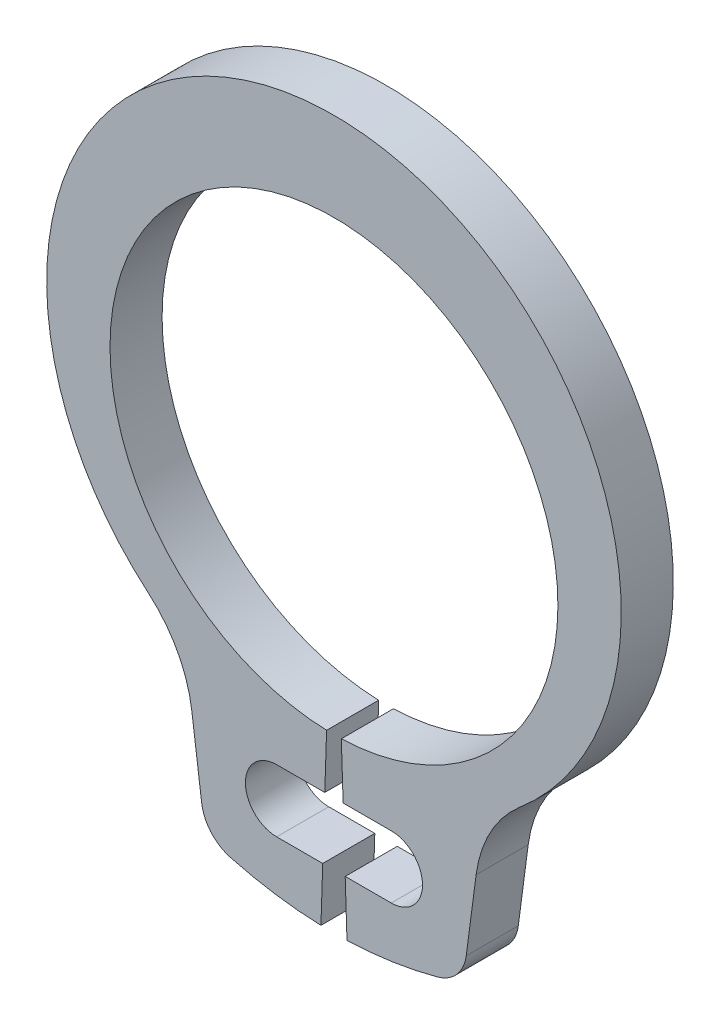
ISO-10303-21;
HEADER;
FILE_DESCRIPTION(('STEP AP214'),'2;1');
FILE_NAME('part.step','',(''),(''),'','','');
FILE_SCHEMA(('AUTOMOTIVE_DESIGN { 1 0 10303 214 1 1 1 1 }'));
ENDSEC;
DATA;
#1=APPLICATION_CONTEXT('core data for automotive mechanical design processes');
#2=APPLICATION_PROTOCOL_DEFINITION('international standard','automotive_design',2000,#1);
#3=PRODUCT_CONTEXT('',#1,'mechanical');
#4=PRODUCT('Part','Part','',(#3));
#5=PRODUCT_RELATED_PRODUCT_CATEGORY('part','',(#4));
#6=PRODUCT_DEFINITION_FORMATION('','',#4);
#7=PRODUCT_DEFINITION_CONTEXT('part definition',#1,'design');
#8=PRODUCT_DEFINITION('design','',#6,#7);
#9=PRODUCT_DEFINITION_SHAPE('','',#8);
#10=(LENGTH_UNIT() NAMED_UNIT(*) SI_UNIT(.MILLI.,.METRE.));
#11=(NAMED_UNIT(*) PLANE_ANGLE_UNIT() SI_UNIT($,.RADIAN.));
#12=(NAMED_UNIT(*) SI_UNIT($,.STERADIAN.) SOLID_ANGLE_UNIT());
#13=UNCERTAINTY_MEASURE_WITH_UNIT(LENGTH_MEASURE(1.E-05),#10,'distance_accuracy_value','');
#14=(GEOMETRIC_REPRESENTATION_CONTEXT(3) GLOBAL_UNCERTAINTY_ASSIGNED_CONTEXT((#13)) GLOBAL_UNIT_ASSIGNED_CONTEXT((#10,
#11,#12)) REPRESENTATION_CONTEXT('',''));
#15=CARTESIAN_POINT('',(0.,0.,0.));
#16=DIRECTION('',(0.,0.,1.));
#17=DIRECTION('',(1.,0.,0.));
#18=AXIS2_PLACEMENT_3D('',#15,#16,#17);
#19=CARTESIAN_POINT('',(-0.141447368421053,-4.29767293334041,-1.));
#20=DIRECTION('',(0.999458821707072,-0.0328947368421052,0.));
#21=DIRECTION('',(0.0328947368421053,0.999458821707072,0.));
#22=AXIS2_PLACEMENT_3D('',#19,#20,#21);
#23=PLANE('',#22);
#24=DIRECTION('',(0.,0.,1.));
#25=VECTOR('',#24,1.);
#26=CARTESIAN_POINT('',(-0.176054474376866,-5.34915960451558,-1.));
#27=LINE('',#26,#25);
#28=CARTESIAN_POINT('',(-0.176054474376866,-5.34915960451558,-1.));
#29=VERTEX_POINT('',#28);
#30=CARTESIAN_POINT('',(-0.176054474376866,-5.34915960451558,0.));
#31=VERTEX_POINT('',#30);
#32=EDGE_CURVE('E217',#29,#31,#27,.T.);
#33=ORIENTED_EDGE('',*,*,#32,.F.);
#34=DIRECTION('',(0.0328947368421053,0.999458821707072,0.));
#35=VECTOR('',#34,1.);
#36=CARTESIAN_POINT('',(-0.141447368421053,-4.29767293334041,-1.));
#37=LINE('',#36,#35);
#38=CARTESIAN_POINT('',(-0.141447368421053,-4.29767293334041,-1.));
#39=VERTEX_POINT('',#38);
#40=EDGE_CURVE('E200',#29,#39,#37,.T.);
#41=ORIENTED_EDGE('',*,*,#40,.T.);
#42=DIRECTION('',(0.,0.,1.));
#43=VECTOR('',#42,1.);
#44=CARTESIAN_POINT('',(-0.141447368421053,-4.29767293334041,-1.));
#45=LINE('',#44,#43);
#46=CARTESIAN_POINT('',(-0.141447368421053,-4.29767293334041,0.));
#47=VERTEX_POINT('',#46);
#48=EDGE_CURVE('E11',#39,#47,#45,.T.);
#49=ORIENTED_EDGE('',*,*,#48,.T.);
#50=DIRECTION('',(0.0328947368421053,0.999458821707072,0.));
#51=VECTOR('',#50,1.);
#52=CARTESIAN_POINT('',(-0.141447368421053,-4.29767293334041,0.));
#53=LINE('',#52,#51);
#54=EDGE_CURVE('E318',#31,#47,#53,.T.);
#55=ORIENTED_EDGE('',*,*,#54,.F.);
#56=EDGE_LOOP('',(#33,#41,#49,#55));
#57=FACE_BOUND('',#56,.T.);
#58=ADVANCED_FACE('F38',(#57),#23,.T.);
#59=CARTESIAN_POINT('',(0.141447368421053,-4.29767293334041,-1.));
#60=DIRECTION('',(-0.999458821707072,-0.0328947368421052,0.));
#61=DIRECTION('',(0.0328947368421053,-0.999458821707072,0.));
#62=AXIS2_PLACEMENT_3D('',#59,#60,#61);
#63=PLANE('',#62);
#64=DIRECTION('',(0.,0.,-1.));
#65=VECTOR('',#64,1.);
#66=CARTESIAN_POINT('',(0.176054474376866,-5.34915960451558,-1.));
#67=LINE('',#66,#65);
#68=CARTESIAN_POINT('',(0.176054474376866,-5.34915960451558,0.));
#69=VERTEX_POINT('',#68);
#70=CARTESIAN_POINT('',(0.176054474376866,-5.34915960451558,-1.));
#71=VERTEX_POINT('',#70);
#72=EDGE_CURVE('E365',#69,#71,#67,.T.);
#73=ORIENTED_EDGE('',*,*,#72,.F.);
#74=DIRECTION('',(0.0328947368421053,-0.999458821707072,0.));
#75=VECTOR('',#74,1.);
#76=CARTESIAN_POINT('',(0.141447368421053,-4.29767293334041,0.));
#77=LINE('',#76,#75);
#78=CARTESIAN_POINT('',(0.141447368421053,-4.29767293334041,0.));
#79=VERTEX_POINT('',#78);
#80=EDGE_CURVE('E278',#79,#69,#77,.T.);
#81=ORIENTED_EDGE('',*,*,#80,.F.);
#82=DIRECTION('',(0.,0.,1.));
#83=VECTOR('',#82,1.);
#84=CARTESIAN_POINT('',(0.141447368421053,-4.29767293334041,-1.));
#85=LINE('',#84,#83);
#86=CARTESIAN_POINT('',(0.141447368421053,-4.29767293334041,-1.));
#87=VERTEX_POINT('',#86);
#88=EDGE_CURVE('E42',#87,#79,#85,.T.);
#89=ORIENTED_EDGE('',*,*,#88,.F.);
#90=DIRECTION('',(0.0328947368421053,-0.999458821707072,0.));
#91=VECTOR('',#90,1.);
#92=CARTESIAN_POINT('',(0.141447368421053,-4.29767293334041,-1.));
#93=LINE('',#92,#91);
#94=EDGE_CURVE('E231',#87,#71,#93,.T.);
#95=ORIENTED_EDGE('',*,*,#94,.T.);
#96=EDGE_LOOP('',(#73,#81,#89,#95));
#97=FACE_BOUND('',#96,.T.);
#98=ADVANCED_FACE('F364',(#97),#63,.T.);
#99=CARTESIAN_POINT('',(0.,0.,-1.));
#100=DIRECTION('',(0.,0.,1.));
#101=DIRECTION('',(1.,0.,0.));
#102=AXIS2_PLACEMENT_3D('',#99,#100,#101);
#103=CYLINDRICAL_SURFACE('',#102,4.3);
#104=CARTESIAN_POINT('',(0.,0.,0.));
#105=DIRECTION('',(0.,0.,-1.));
#106=DIRECTION('',(1.,0.,0.));
#107=AXIS2_PLACEMENT_3D('',#104,#105,#106);
#108=CIRCLE('',#107,4.3);
#109=EDGE_CURVE('E223',#47,#79,#108,.T.);
#110=ORIENTED_EDGE('',*,*,#109,.F.);
#111=ORIENTED_EDGE('',*,*,#48,.F.);
#112=CARTESIAN_POINT('',(0.,0.,-1.));
#113=DIRECTION('',(0.,0.,-1.));
#114=DIRECTION('',(1.,0.,0.));
#115=AXIS2_PLACEMENT_3D('',#112,#113,#114);
#116=CIRCLE('',#115,4.3);
#117=EDGE_CURVE('E225',#39,#87,#116,.T.);
#118=ORIENTED_EDGE('',*,*,#117,.T.);
#119=ORIENTED_EDGE('',*,*,#88,.T.);
#120=EDGE_LOOP('',(#110,#111,#118,#119));
#121=FACE_BOUND('',#120,.T.);
#122=ADVANCED_FACE('F40',(#121),#103,.F.);
#123=DIRECTION('',(0.,0.,-1.));
#124=VECTOR('',#123,1.);
#125=CARTESIAN_POINT('',(-0.215549532455502,-6.54915960451558,-1.));
#126=LINE('',#125,#124);
#127=CARTESIAN_POINT('',(-0.215549532455502,-6.54915960451558,0.));
#128=VERTEX_POINT('',#127);
#129=CARTESIAN_POINT('',(-0.215549532455502,-6.54915960451558,-1.));
#130=VERTEX_POINT('',#129);
#131=EDGE_CURVE('E398',#128,#130,#126,.T.);
#132=ORIENTED_EDGE('',*,*,#131,.F.);
#133=CARTESIAN_POINT('',(-0.25,-7.59588704497375,0.));
#134=VERTEX_POINT('',#133);
#135=EDGE_CURVE('E230',#134,#128,#53,.T.);
#136=ORIENTED_EDGE('',*,*,#135,.F.);
#137=DIRECTION('',(0.,0.,1.));
#138=VECTOR('',#137,1.);
#139=CARTESIAN_POINT('',(-0.25,-7.59588704497375,-1.));
#140=LINE('',#139,#138);
#141=CARTESIAN_POINT('',(-0.25,-7.59588704497375,-1.));
#142=VERTEX_POINT('',#141);
#143=EDGE_CURVE('E48',#142,#134,#140,.T.);
#144=ORIENTED_EDGE('',*,*,#143,.F.);
#145=EDGE_CURVE('E270',#142,#130,#37,.T.);
#146=ORIENTED_EDGE('',*,*,#145,.T.);
#147=EDGE_LOOP('',(#132,#136,#144,#146));
#148=FACE_BOUND('',#147,.T.);
#149=ADVANCED_FACE('F467',(#148),#23,.T.);
#150=CARTESIAN_POINT('',(0.,0.,-1.));
#151=DIRECTION('',(0.,0.,1.));
#152=DIRECTION('',(1.,0.,0.));
#153=AXIS2_PLACEMENT_3D('',#150,#151,#152);
#154=CYLINDRICAL_SURFACE('',#153,7.6);
#155=CARTESIAN_POINT('',(0.,0.,0.));
#156=DIRECTION('',(0.,0.,1.));
#157=DIRECTION('',(1.,0.,0.));
#158=AXIS2_PLACEMENT_3D('',#155,#156,#157);
#159=CIRCLE('',#158,7.6);
#160=CARTESIAN_POINT('',(-1.99252293458548,-7.33415655376614,0.));
#161=VERTEX_POINT('',#160);
#162=EDGE_CURVE('E314',#161,#134,#159,.T.);
#163=ORIENTED_EDGE('',*,*,#162,.F.);
#164=DIRECTION('',(0.,0.,1.));
#165=VECTOR('',#164,1.);
#166=CARTESIAN_POINT('',(-1.99252293458548,-7.33415655376614,-1.));
#167=LINE('',#166,#165);
#168=CARTESIAN_POINT('',(-1.99252293458548,-7.33415655376614,-1.));
#169=VERTEX_POINT('',#168);
#170=EDGE_CURVE('E324',#169,#161,#167,.T.);
#171=ORIENTED_EDGE('',*,*,#170,.F.);
#172=CARTESIAN_POINT('',(0.,0.,-1.));
#173=DIRECTION('',(0.,0.,1.));
#174=DIRECTION('',(1.,0.,0.));
#175=AXIS2_PLACEMENT_3D('',#172,#173,#174);
#176=CIRCLE('',#175,7.6);
#177=EDGE_CURVE('E266',#169,#142,#176,.T.);
#178=ORIENTED_EDGE('',*,*,#177,.T.);
#179=ORIENTED_EDGE('',*,*,#143,.T.);
#180=EDGE_LOOP('',(#163,#171,#178,#179));
#181=FACE_BOUND('',#180,.T.);
#182=ADVANCED_FACE('F472',(#181),#154,.T.);
#183=CARTESIAN_POINT('',(-1.79589238183033,-6.61039110438133,-1.));
#184=DIRECTION('',(0.,0.,1.));
#185=DIRECTION('',(1.,0.,0.));
#186=AXIS2_PLACEMENT_3D('',#183,#184,#185);
#187=CYLINDRICAL_SURFACE('',#186,0.749999999999999);
#188=CARTESIAN_POINT('',(-1.79589238183033,-6.61039110438133,0.));
#189=DIRECTION('',(0.,0.,1.));
#190=DIRECTION('',(1.,0.,0.));
#191=AXIS2_PLACEMENT_3D('',#188,#189,#190);
#192=CIRCLE('',#191,0.749999999999999);
#193=CARTESIAN_POINT('',(-2.53947602786069,-6.70828574854637,0.));
#194=VERTEX_POINT('',#193);
#195=EDGE_CURVE('E310',#194,#161,#192,.T.);
#196=ORIENTED_EDGE('',*,*,#195,.F.);
#197=DIRECTION('',(0.,0.,1.));
#198=VECTOR('',#197,1.);
#199=CARTESIAN_POINT('',(-2.53947602786069,-6.70828574854637,-1.));
#200=LINE('',#199,#198);
#201=CARTESIAN_POINT('',(-2.53947602786069,-6.70828574854637,-1.));
#202=VERTEX_POINT('',#201);
#203=EDGE_CURVE('E327',#202,#194,#200,.T.);
#204=ORIENTED_EDGE('',*,*,#203,.F.);
#205=CARTESIAN_POINT('',(-1.79589238183033,-6.61039110438133,-1.));
#206=DIRECTION('',(0.,0.,1.));
#207=DIRECTION('',(1.,0.,0.));
#208=AXIS2_PLACEMENT_3D('',#205,#206,#207);
#209=CIRCLE('',#208,0.749999999999999);
#210=EDGE_CURVE('E262',#202,#169,#209,.T.);
#211=ORIENTED_EDGE('',*,*,#210,.T.);
#212=ORIENTED_EDGE('',*,*,#170,.T.);
#213=EDGE_LOOP('',(#196,#204,#211,#212));
#214=FACE_BOUND('',#213,.T.);
#215=ADVANCED_FACE('F460',(#214),#187,.T.);
#216=CARTESIAN_POINT('',(-2.72955632905345,-5.2644825190134,-1.));
#217=DIRECTION('',(-0.99144486137381,-0.130526192220052,0.));
#218=DIRECTION('',(0.130526192220052,-0.99144486137381,0.));
#219=AXIS2_PLACEMENT_3D('',#216,#217,#218);
#220=PLANE('',#219);
#221=DIRECTION('',(0.130526192220052,-0.99144486137381,0.));
#222=VECTOR('',#221,1.);
#223=CARTESIAN_POINT('',(-2.72955632905345,-5.2644825190134,0.));
#224=LINE('',#223,#222);
#225=CARTESIAN_POINT('',(-2.72955632905345,-5.2644825190134,0.));
#226=VERTEX_POINT('',#225);
#227=EDGE_CURVE('E306',#226,#194,#224,.T.);
#228=ORIENTED_EDGE('',*,*,#227,.F.);
#229=DIRECTION('',(0.,0.,1.));
#230=VECTOR('',#229,1.);
#231=CARTESIAN_POINT('',(-2.72955632905345,-5.2644825190134,-1.));
#232=LINE('',#231,#230);
#233=CARTESIAN_POINT('',(-2.72955632905345,-5.2644825190134,-1.));
#234=VERTEX_POINT('',#233);
#235=EDGE_CURVE('E330',#234,#226,#232,.T.);
#236=ORIENTED_EDGE('',*,*,#235,.F.);
#237=DIRECTION('',(0.130526192220052,-0.99144486137381,0.));
#238=VECTOR('',#237,1.);
#239=CARTESIAN_POINT('',(-2.72955632905345,-5.2644825190134,-1.));
#240=LINE('',#239,#238);
#241=EDGE_CURVE('E258',#234,#202,#240,.T.);
#242=ORIENTED_EDGE('',*,*,#241,.T.);
#243=ORIENTED_EDGE('',*,*,#203,.T.);
#244=EDGE_LOOP('',(#228,#236,#242,#243));
#245=FACE_BOUND('',#244,.T.);
#246=ADVANCED_FACE('F456',(#245),#220,.T.);
#247=CARTESIAN_POINT('',(-5.15560880600109,-5.58387838688165,-1.));
#248=DIRECTION('',(0.,0.,1.));
#249=DIRECTION('',(1.,0.,0.));
#250=AXIS2_PLACEMENT_3D('',#247,#248,#249);
#251=CYLINDRICAL_SURFACE('',#250,2.4469867881366);
#252=CARTESIAN_POINT('',(-5.15560880600109,-5.58387838688165,0.));
#253=DIRECTION('',(0.,0.,-1.));
#254=DIRECTION('',(1.,0.,0.));
#255=AXIS2_PLACEMENT_3D('',#252,#253,#254);
#256=CIRCLE('',#255,2.4469867881366);
#257=CARTESIAN_POINT('',(-3.57124666917764,-3.71906178444716,0.));
#258=VERTEX_POINT('',#257);
#259=EDGE_CURVE('E302',#258,#226,#256,.T.);
#260=ORIENTED_EDGE('',*,*,#259,.F.);
#261=DIRECTION('',(0.,0.,1.));
#262=VECTOR('',#261,1.);
#263=CARTESIAN_POINT('',(-3.57124666917764,-3.71906178444716,-1.));
#264=LINE('',#263,#262);
#265=CARTESIAN_POINT('',(-3.57124666917764,-3.71906178444716,-1.));
#266=VERTEX_POINT('',#265);
#267=EDGE_CURVE('E333',#266,#258,#264,.T.);
#268=ORIENTED_EDGE('',*,*,#267,.F.);
#269=CARTESIAN_POINT('',(-5.15560880600109,-5.58387838688165,-1.));
#270=DIRECTION('',(0.,0.,-1.));
#271=DIRECTION('',(1.,0.,0.));
#272=AXIS2_PLACEMENT_3D('',#269,#270,#271);
#273=CIRCLE('',#272,2.4469867881366);
#274=EDGE_CURVE('E254',#266,#234,#273,.T.);
#275=ORIENTED_EDGE('',*,*,#274,.T.);
#276=ORIENTED_EDGE('',*,*,#235,.T.);
#277=EDGE_LOOP('',(#260,#268,#275,#276));
#278=FACE_BOUND('',#277,.T.);
#279=ADVANCED_FACE('F452',(#278),#251,.F.);
#280=CARTESIAN_POINT('',(0.,0.484345962612266,-1.));
#281=DIRECTION('',(0.,0.,1.));
#282=DIRECTION('',(1.,0.,0.));
#283=AXIS2_PLACEMENT_3D('',#280,#281,#282);
#284=CYLINDRICAL_SURFACE('',#283,5.51565403738773);
#285=CARTESIAN_POINT('',(0.,0.484345962612266,0.));
#286=DIRECTION('',(0.,0.,1.));
#287=DIRECTION('',(1.,0.,0.));
#288=AXIS2_PLACEMENT_3D('',#285,#286,#287);
#289=CIRCLE('',#288,5.51565403738773);
#290=CARTESIAN_POINT('',(3.57124666917764,-3.71906178444716,0.));
#291=VERTEX_POINT('',#290);
#292=EDGE_CURVE('E298',#291,#258,#289,.T.);
#293=ORIENTED_EDGE('',*,*,#292,.F.);
#294=DIRECTION('',(0.,0.,1.));
#295=VECTOR('',#294,1.);
#296=CARTESIAN_POINT('',(3.57124666917764,-3.71906178444716,-1.));
#297=LINE('',#296,#295);
#298=CARTESIAN_POINT('',(3.57124666917764,-3.71906178444716,-1.));
#299=VERTEX_POINT('',#298);
#300=EDGE_CURVE('E336',#299,#291,#297,.T.);
#301=ORIENTED_EDGE('',*,*,#300,.F.);
#302=CARTESIAN_POINT('',(0.,0.484345962612266,-1.));
#303=DIRECTION('',(0.,0.,1.));
#304=DIRECTION('',(1.,0.,0.));
#305=AXIS2_PLACEMENT_3D('',#302,#303,#304);
#306=CIRCLE('',#305,5.51565403738773);
#307=EDGE_CURVE('E250',#299,#266,#306,.T.);
#308=ORIENTED_EDGE('',*,*,#307,.T.);
#309=ORIENTED_EDGE('',*,*,#267,.T.);
#310=EDGE_LOOP('',(#293,#301,#308,#309));
#311=FACE_BOUND('',#310,.T.);
#312=ADVANCED_FACE('F448',(#311),#284,.T.);
#313=CARTESIAN_POINT('',(5.15560880600109,-5.58387838688165,-1.));
#314=DIRECTION('',(0.,0.,1.));
#315=DIRECTION('',(1.,0.,0.));
#316=AXIS2_PLACEMENT_3D('',#313,#314,#315);
#317=CYLINDRICAL_SURFACE('',#316,2.4469867881366);
#318=CARTESIAN_POINT('',(5.15560880600109,-5.58387838688165,0.));
#319=DIRECTION('',(0.,0.,-1.));
#320=DIRECTION('',(1.,0.,0.));
#321=AXIS2_PLACEMENT_3D('',#318,#319,#320);
#322=CIRCLE('',#321,2.4469867881366);
#323=CARTESIAN_POINT('',(2.72955632905346,-5.2644825190134,0.));
#324=VERTEX_POINT('',#323);
#325=EDGE_CURVE('E294',#324,#291,#322,.T.);
#326=ORIENTED_EDGE('',*,*,#325,.F.);
#327=DIRECTION('',(0.,0.,1.));
#328=VECTOR('',#327,1.);
#329=CARTESIAN_POINT('',(2.72955632905346,-5.2644825190134,-1.));
#330=LINE('',#329,#328);
#331=CARTESIAN_POINT('',(2.72955632905346,-5.2644825190134,-1.));
#332=VERTEX_POINT('',#331);
#333=EDGE_CURVE('E339',#332,#324,#330,.T.);
#334=ORIENTED_EDGE('',*,*,#333,.F.);
#335=CARTESIAN_POINT('',(5.15560880600109,-5.58387838688165,-1.));
#336=DIRECTION('',(0.,0.,-1.));
#337=DIRECTION('',(1.,0.,0.));
#338=AXIS2_PLACEMENT_3D('',#335,#336,#337);
#339=CIRCLE('',#338,2.4469867881366);
#340=EDGE_CURVE('E246',#332,#299,#339,.T.);
#341=ORIENTED_EDGE('',*,*,#340,.T.);
#342=ORIENTED_EDGE('',*,*,#300,.T.);
#343=EDGE_LOOP('',(#326,#334,#341,#342));
#344=FACE_BOUND('',#343,.T.);
#345=ADVANCED_FACE('F444',(#344),#317,.F.);
#346=CARTESIAN_POINT('',(2.72955632905345,-5.2644825190134,-1.));
#347=DIRECTION('',(0.99144486137381,-0.130526192220052,0.));
#348=DIRECTION('',(0.130526192220052,0.99144486137381,0.));
#349=AXIS2_PLACEMENT_3D('',#346,#347,#348);
#350=PLANE('',#349);
#351=DIRECTION('',(0.130526192220052,0.99144486137381,0.));
#352=VECTOR('',#351,1.);
#353=CARTESIAN_POINT('',(2.72955632905345,-5.2644825190134,0.));
#354=LINE('',#353,#352);
#355=CARTESIAN_POINT('',(2.53947602786069,-6.70828574854637,0.));
#356=VERTEX_POINT('',#355);
#357=EDGE_CURVE('E290',#356,#324,#354,.T.);
#358=ORIENTED_EDGE('',*,*,#357,.F.);
#359=DIRECTION('',(0.,0.,1.));
#360=VECTOR('',#359,1.);
#361=CARTESIAN_POINT('',(2.53947602786069,-6.70828574854637,-1.));
#362=LINE('',#361,#360);
#363=CARTESIAN_POINT('',(2.53947602786069,-6.70828574854637,-1.));
#364=VERTEX_POINT('',#363);
#365=EDGE_CURVE('E342',#364,#356,#362,.T.);
#366=ORIENTED_EDGE('',*,*,#365,.F.);
#367=DIRECTION('',(0.130526192220052,0.99144486137381,0.));
#368=VECTOR('',#367,1.);
#369=CARTESIAN_POINT('',(2.72955632905345,-5.2644825190134,-1.));
#370=LINE('',#369,#368);
#371=EDGE_CURVE('E242',#364,#332,#370,.T.);
#372=ORIENTED_EDGE('',*,*,#371,.T.);
#373=ORIENTED_EDGE('',*,*,#333,.T.);
#374=EDGE_LOOP('',(#358,#366,#372,#373));
#375=FACE_BOUND('',#374,.T.);
#376=ADVANCED_FACE('F441',(#375),#350,.T.);
#377=CARTESIAN_POINT('',(1.79589238183033,-6.61039110438133,-1.));
#378=DIRECTION('',(0.,0.,1.));
#379=DIRECTION('',(1.,0.,0.));
#380=AXIS2_PLACEMENT_3D('',#377,#378,#379);
#381=CYLINDRICAL_SURFACE('',#380,0.749999999999999);
#382=CARTESIAN_POINT('',(1.79589238183033,-6.61039110438133,0.));
#383=DIRECTION('',(0.,0.,1.));
#384=DIRECTION('',(-1.,0.,0.));
#385=AXIS2_PLACEMENT_3D('',#382,#383,#384);
#386=CIRCLE('',#385,0.749999999999999);
#387=CARTESIAN_POINT('',(1.99252293458548,-7.33415655376614,0.));
#388=VERTEX_POINT('',#387);
#389=EDGE_CURVE('E286',#388,#356,#386,.T.);
#390=ORIENTED_EDGE('',*,*,#389,.F.);
#391=DIRECTION('',(0.,0.,1.));
#392=VECTOR('',#391,1.);
#393=CARTESIAN_POINT('',(1.99252293458548,-7.33415655376614,-1.));
#394=LINE('',#393,#392);
#395=CARTESIAN_POINT('',(1.99252293458548,-7.33415655376614,-1.));
#396=VERTEX_POINT('',#395);
#397=EDGE_CURVE('E345',#396,#388,#394,.T.);
#398=ORIENTED_EDGE('',*,*,#397,.F.);
#399=CARTESIAN_POINT('',(1.79589238183033,-6.61039110438133,-1.));
#400=DIRECTION('',(0.,0.,1.));
#401=DIRECTION('',(-1.,0.,0.));
#402=AXIS2_PLACEMENT_3D('',#399,#400,#401);
#403=CIRCLE('',#402,0.749999999999999);
#404=EDGE_CURVE('E238',#396,#364,#403,.T.);
#405=ORIENTED_EDGE('',*,*,#404,.T.);
#406=ORIENTED_EDGE('',*,*,#365,.T.);
#407=EDGE_LOOP('',(#390,#398,#405,#406));
#408=FACE_BOUND('',#407,.T.);
#409=ADVANCED_FACE('F437',(#408),#381,.T.);
#410=CARTESIAN_POINT('',(0.,0.,-1.));
#411=DIRECTION('',(0.,0.,1.));
#412=DIRECTION('',(1.,0.,0.));
#413=AXIS2_PLACEMENT_3D('',#410,#411,#412);
#414=CYLINDRICAL_SURFACE('',#413,7.6);
#415=CARTESIAN_POINT('',(0.,0.,0.));
#416=DIRECTION('',(0.,0.,1.));
#417=DIRECTION('',(1.,0.,0.));
#418=AXIS2_PLACEMENT_3D('',#415,#416,#417);
#419=CIRCLE('',#418,7.6);
#420=CARTESIAN_POINT('',(0.249999999999995,-7.59588704497375,0.));
#421=VERTEX_POINT('',#420);
#422=EDGE_CURVE('E282',#421,#388,#419,.T.);
#423=ORIENTED_EDGE('',*,*,#422,.F.);
#424=DIRECTION('',(0.,0.,1.));
#425=VECTOR('',#424,1.);
#426=CARTESIAN_POINT('',(0.249999999999995,-7.59588704497375,-1.));
#427=LINE('',#426,#425);
#428=CARTESIAN_POINT('',(0.249999999999995,-7.59588704497375,-1.));
#429=VERTEX_POINT('',#428);
#430=EDGE_CURVE('E347',#429,#421,#427,.T.);
#431=ORIENTED_EDGE('',*,*,#430,.F.);
#432=CARTESIAN_POINT('',(0.,0.,-1.));
#433=DIRECTION('',(0.,0.,1.));
#434=DIRECTION('',(1.,0.,0.));
#435=AXIS2_PLACEMENT_3D('',#432,#433,#434);
#436=CIRCLE('',#435,7.6);
#437=EDGE_CURVE('E234',#429,#396,#436,.T.);
#438=ORIENTED_EDGE('',*,*,#437,.T.);
#439=ORIENTED_EDGE('',*,*,#397,.T.);
#440=EDGE_LOOP('',(#423,#431,#438,#439));
#441=FACE_BOUND('',#440,.T.);
#442=ADVANCED_FACE('F434',(#441),#414,.T.);
#443=DIRECTION('',(0.,0.,1.));
#444=VECTOR('',#443,1.);
#445=CARTESIAN_POINT('',(0.215549532455502,-6.54915960451558,-1.));
#446=LINE('',#445,#444);
#447=CARTESIAN_POINT('',(0.215549532455502,-6.54915960451558,-1.));
#448=VERTEX_POINT('',#447);
#449=CARTESIAN_POINT('',(0.215549532455502,-6.54915960451558,0.));
#450=VERTEX_POINT('',#449);
#451=EDGE_CURVE('E390',#448,#450,#446,.T.);
#452=ORIENTED_EDGE('',*,*,#451,.F.);
#453=EDGE_CURVE('E229',#448,#429,#93,.T.);
#454=ORIENTED_EDGE('',*,*,#453,.T.);
#455=ORIENTED_EDGE('',*,*,#430,.T.);
#456=EDGE_CURVE('E277',#450,#421,#77,.T.);
#457=ORIENTED_EDGE('',*,*,#456,.F.);
#458=EDGE_LOOP('',(#452,#454,#455,#457));
#459=FACE_BOUND('',#458,.T.);
#460=ADVANCED_FACE('F428',(#459),#63,.T.);
#461=CARTESIAN_POINT('',(0.,0.,-1.));
#462=DIRECTION('',(0.,0.,1.));
#463=DIRECTION('',(1.,0.,0.));
#464=AXIS2_PLACEMENT_3D('',#461,#462,#463);
#465=PLANE('',#464);
#466=CARTESIAN_POINT('',(1.1,-5.94915960451558,-1.));
#467=DIRECTION('',(0.,0.,1.));
#468=DIRECTION('',(1.,0.,0.));
#469=AXIS2_PLACEMENT_3D('',#466,#467,#468);
#470=CIRCLE('',#469,0.6);
#471=CARTESIAN_POINT('',(1.1,-6.54915960451558,-1.));
#472=VERTEX_POINT('',#471);
#473=CARTESIAN_POINT('',(1.1,-5.34915960451558,-1.));
#474=VERTEX_POINT('',#473);
#475=EDGE_CURVE('E215',#472,#474,#470,.T.);
#476=ORIENTED_EDGE('',*,*,#475,.T.);
#477=DIRECTION('',(-1.,0.,0.));
#478=VECTOR('',#477,1.);
#479=CARTESIAN_POINT('',(-1.1,-5.34915960451558,-1.));
#480=LINE('',#479,#478);
#481=EDGE_CURVE('E64',#474,#71,#480,.T.);
#482=ORIENTED_EDGE('',*,*,#481,.T.);
#483=ORIENTED_EDGE('',*,*,#94,.F.);
#484=ORIENTED_EDGE('',*,*,#117,.F.);
#485=ORIENTED_EDGE('',*,*,#40,.F.);
#486=CARTESIAN_POINT('',(-1.1,-5.34915960451558,-1.));
#487=VERTEX_POINT('',#486);
#488=EDGE_CURVE('E180',#29,#487,#480,.T.);
#489=ORIENTED_EDGE('',*,*,#488,.T.);
#490=CARTESIAN_POINT('',(-1.1,-5.94915960451558,-1.));
#491=DIRECTION('',(0.,0.,1.));
#492=DIRECTION('',(1.,0.,0.));
#493=AXIS2_PLACEMENT_3D('',#490,#491,#492);
#494=CIRCLE('',#493,0.6);
#495=CARTESIAN_POINT('',(-1.1,-6.54915960451558,-1.));
#496=VERTEX_POINT('',#495);
#497=EDGE_CURVE('E198',#487,#496,#494,.T.);
#498=ORIENTED_EDGE('',*,*,#497,.T.);
#499=DIRECTION('',(1.,0.,0.));
#500=VECTOR('',#499,1.);
#501=CARTESIAN_POINT('',(1.1,-6.54915960451558,-1.));
#502=LINE('',#501,#500);
#503=EDGE_CURVE('E190',#496,#130,#502,.T.);
#504=ORIENTED_EDGE('',*,*,#503,.T.);
#505=ORIENTED_EDGE('',*,*,#145,.F.);
#506=ORIENTED_EDGE('',*,*,#177,.F.);
#507=ORIENTED_EDGE('',*,*,#210,.F.);
#508=ORIENTED_EDGE('',*,*,#241,.F.);
#509=ORIENTED_EDGE('',*,*,#274,.F.);
#510=ORIENTED_EDGE('',*,*,#307,.F.);
#511=ORIENTED_EDGE('',*,*,#340,.F.);
#512=ORIENTED_EDGE('',*,*,#371,.F.);
#513=ORIENTED_EDGE('',*,*,#404,.F.);
#514=ORIENTED_EDGE('',*,*,#437,.F.);
#515=ORIENTED_EDGE('',*,*,#453,.F.);
#516=EDGE_CURVE('E375',#448,#472,#502,.T.);
#517=ORIENTED_EDGE('',*,*,#516,.T.);
#518=EDGE_LOOP('',(#476,#482,#483,#484,#485,#489,#498,#504,#505,#506,#507,#508,#509,#510,#511,
#512,#513,#514,#515,#517));
#519=FACE_BOUND('',#518,.T.);
#520=ADVANCED_FACE('F196',(#519),#465,.F.);
#521=CARTESIAN_POINT('',(0.,0.,0.));
#522=DIRECTION('',(0.,0.,1.));
#523=DIRECTION('',(1.,0.,0.));
#524=AXIS2_PLACEMENT_3D('',#521,#522,#523);
#525=PLANE('',#524);
#526=DIRECTION('',(-1.,0.,0.));
#527=VECTOR('',#526,1.);
#528=CARTESIAN_POINT('',(-1.1,-5.34915960451558,0.));
#529=LINE('',#528,#527);
#530=CARTESIAN_POINT('',(1.1,-5.34915960451558,0.));
#531=VERTEX_POINT('',#530);
#532=EDGE_CURVE('E383',#531,#69,#529,.T.);
#533=ORIENTED_EDGE('',*,*,#532,.F.);
#534=CARTESIAN_POINT('',(1.1,-5.94915960451558,0.));
#535=DIRECTION('',(0.,0.,1.));
#536=DIRECTION('',(1.,0.,0.));
#537=AXIS2_PLACEMENT_3D('',#534,#535,#536);
#538=CIRCLE('',#537,0.6);
#539=CARTESIAN_POINT('',(1.1,-6.54915960451558,0.));
#540=VERTEX_POINT('',#539);
#541=EDGE_CURVE('E207',#540,#531,#538,.T.);
#542=ORIENTED_EDGE('',*,*,#541,.F.);
#543=DIRECTION('',(1.,0.,0.));
#544=VECTOR('',#543,1.);
#545=CARTESIAN_POINT('',(1.1,-6.54915960451558,0.));
#546=LINE('',#545,#544);
#547=EDGE_CURVE('E56',#450,#540,#546,.T.);
#548=ORIENTED_EDGE('',*,*,#547,.F.);
#549=ORIENTED_EDGE('',*,*,#456,.T.);
#550=ORIENTED_EDGE('',*,*,#422,.T.);
#551=ORIENTED_EDGE('',*,*,#389,.T.);
#552=ORIENTED_EDGE('',*,*,#357,.T.);
#553=ORIENTED_EDGE('',*,*,#325,.T.);
#554=ORIENTED_EDGE('',*,*,#292,.T.);
#555=ORIENTED_EDGE('',*,*,#259,.T.);
#556=ORIENTED_EDGE('',*,*,#227,.T.);
#557=ORIENTED_EDGE('',*,*,#195,.T.);
#558=ORIENTED_EDGE('',*,*,#162,.T.);
#559=ORIENTED_EDGE('',*,*,#135,.T.);
#560=CARTESIAN_POINT('',(-1.1,-6.54915960451558,0.));
#561=VERTEX_POINT('',#560);
#562=EDGE_CURVE('E202',#561,#128,#546,.T.);
#563=ORIENTED_EDGE('',*,*,#562,.F.);
#564=CARTESIAN_POINT('',(-1.1,-5.94915960451558,0.));
#565=DIRECTION('',(0.,0.,1.));
#566=DIRECTION('',(1.,0.,0.));
#567=AXIS2_PLACEMENT_3D('',#564,#565,#566);
#568=CIRCLE('',#567,0.6);
#569=CARTESIAN_POINT('',(-1.1,-5.34915960451558,0.));
#570=VERTEX_POINT('',#569);
#571=EDGE_CURVE('E208',#570,#561,#568,.T.);
#572=ORIENTED_EDGE('',*,*,#571,.F.);
#573=EDGE_CURVE('E183',#31,#570,#529,.T.);
#574=ORIENTED_EDGE('',*,*,#573,.F.);
#575=ORIENTED_EDGE('',*,*,#54,.T.);
#576=ORIENTED_EDGE('',*,*,#109,.T.);
#577=ORIENTED_EDGE('',*,*,#80,.T.);
#578=EDGE_LOOP('',(#533,#542,#548,#549,#550,#551,#552,#553,#554,#555,#556,#557,#558,#559,#563,
#572,#574,#575,#576,#577));
#579=FACE_BOUND('',#578,.T.);
#580=ADVANCED_FACE('F368',(#579),#525,.T.);
#581=CARTESIAN_POINT('',(1.1,-5.94915960451558,-1.));
#582=DIRECTION('',(0.,0.,1.));
#583=DIRECTION('',(1.,0.,0.));
#584=AXIS2_PLACEMENT_3D('',#581,#582,#583);
#585=CYLINDRICAL_SURFACE('',#584,0.6);
#586=ORIENTED_EDGE('',*,*,#541,.T.);
#587=DIRECTION('',(0.,0.,1.));
#588=VECTOR('',#587,1.);
#589=CARTESIAN_POINT('',(1.1,-5.34915960451558,-1.));
#590=LINE('',#589,#588);
#591=EDGE_CURVE('E388',#474,#531,#590,.T.);
#592=ORIENTED_EDGE('',*,*,#591,.F.);
#593=ORIENTED_EDGE('',*,*,#475,.F.);
#594=DIRECTION('',(0.,0.,1.));
#595=VECTOR('',#594,1.);
#596=CARTESIAN_POINT('',(1.1,-6.54915960451558,-1.));
#597=LINE('',#596,#595);
#598=EDGE_CURVE('E391',#472,#540,#597,.T.);
#599=ORIENTED_EDGE('',*,*,#598,.T.);
#600=EDGE_LOOP('',(#586,#592,#593,#599));
#601=FACE_BOUND('',#600,.T.);
#602=ADVANCED_FACE('F488',(#601),#585,.F.);
#603=CARTESIAN_POINT('',(-1.1,-5.94915960451558,-1.));
#604=DIRECTION('',(0.,0.,1.));
#605=DIRECTION('',(1.,0.,0.));
#606=AXIS2_PLACEMENT_3D('',#603,#604,#605);
#607=CYLINDRICAL_SURFACE('',#606,0.6);
#608=ORIENTED_EDGE('',*,*,#571,.T.);
#609=DIRECTION('',(0.,0.,1.));
#610=VECTOR('',#609,1.);
#611=CARTESIAN_POINT('',(-1.1,-6.54915960451558,-1.));
#612=LINE('',#611,#610);
#613=EDGE_CURVE('E189',#496,#561,#612,.T.);
#614=ORIENTED_EDGE('',*,*,#613,.F.);
#615=ORIENTED_EDGE('',*,*,#497,.F.);
#616=DIRECTION('',(0.,0.,1.));
#617=VECTOR('',#616,1.);
#618=CARTESIAN_POINT('',(-1.1,-5.34915960451558,-1.));
#619=LINE('',#618,#617);
#620=EDGE_CURVE('E177',#487,#570,#619,.T.);
#621=ORIENTED_EDGE('',*,*,#620,.T.);
#622=EDGE_LOOP('',(#608,#614,#615,#621));
#623=FACE_BOUND('',#622,.T.);
#624=ADVANCED_FACE('F205',(#623),#607,.F.);
#625=CARTESIAN_POINT('',(-1.1,-5.34915960451558,-1.));
#626=DIRECTION('',(0.,1.,0.));
#627=DIRECTION('',(0.,0.,1.));
#628=AXIS2_PLACEMENT_3D('',#625,#626,#627);
#629=PLANE('',#628);
#630=ORIENTED_EDGE('',*,*,#32,.T.);
#631=ORIENTED_EDGE('',*,*,#573,.T.);
#632=ORIENTED_EDGE('',*,*,#620,.F.);
#633=ORIENTED_EDGE('',*,*,#488,.F.);
#634=EDGE_LOOP('',(#630,#631,#632,#633));
#635=FACE_BOUND('',#634,.T.);
#636=ADVANCED_FACE('F179',(#635),#629,.F.);
#637=CARTESIAN_POINT('',(1.1,-6.54915960451558,-1.));
#638=DIRECTION('',(0.,-1.,0.));
#639=DIRECTION('',(0.,0.,-1.));
#640=AXIS2_PLACEMENT_3D('',#637,#638,#639);
#641=PLANE('',#640);
#642=ORIENTED_EDGE('',*,*,#131,.T.);
#643=ORIENTED_EDGE('',*,*,#503,.F.);
#644=ORIENTED_EDGE('',*,*,#613,.T.);
#645=ORIENTED_EDGE('',*,*,#562,.T.);
#646=EDGE_LOOP('',(#642,#643,#644,#645));
#647=FACE_BOUND('',#646,.T.);
#648=ADVANCED_FACE('F470',(#647),#641,.F.);
#649=ORIENTED_EDGE('',*,*,#451,.T.);
#650=ORIENTED_EDGE('',*,*,#547,.T.);
#651=ORIENTED_EDGE('',*,*,#598,.F.);
#652=ORIENTED_EDGE('',*,*,#516,.F.);
#653=EDGE_LOOP('',(#649,#650,#651,#652));
#654=FACE_BOUND('',#653,.T.);
#655=ADVANCED_FACE('F499',(#654),#641,.F.);
#656=ORIENTED_EDGE('',*,*,#72,.T.);
#657=ORIENTED_EDGE('',*,*,#481,.F.);
#658=ORIENTED_EDGE('',*,*,#591,.T.);
#659=ORIENTED_EDGE('',*,*,#532,.T.);
#660=EDGE_LOOP('',(#656,#657,#658,#659));
#661=FACE_BOUND('',#660,.T.);
#662=ADVANCED_FACE('F496',(#661),#629,.F.);
#663=CLOSED_SHELL('',(#58,#98,#122,#149,#182,#215,#246,#279,#312,#345,#376,#409,#442,#460,#520,
#580,#602,#624,#636,#648,#655,#662));
#664=MANIFOLD_SOLID_BREP('B2',#663);
#665=ADVANCED_BREP_SHAPE_REPRESENTATION('',(#18,#664),#14);
#666=SHAPE_DEFINITION_REPRESENTATION(#9,#665);
ENDSEC;
END-ISO-10303-21;
